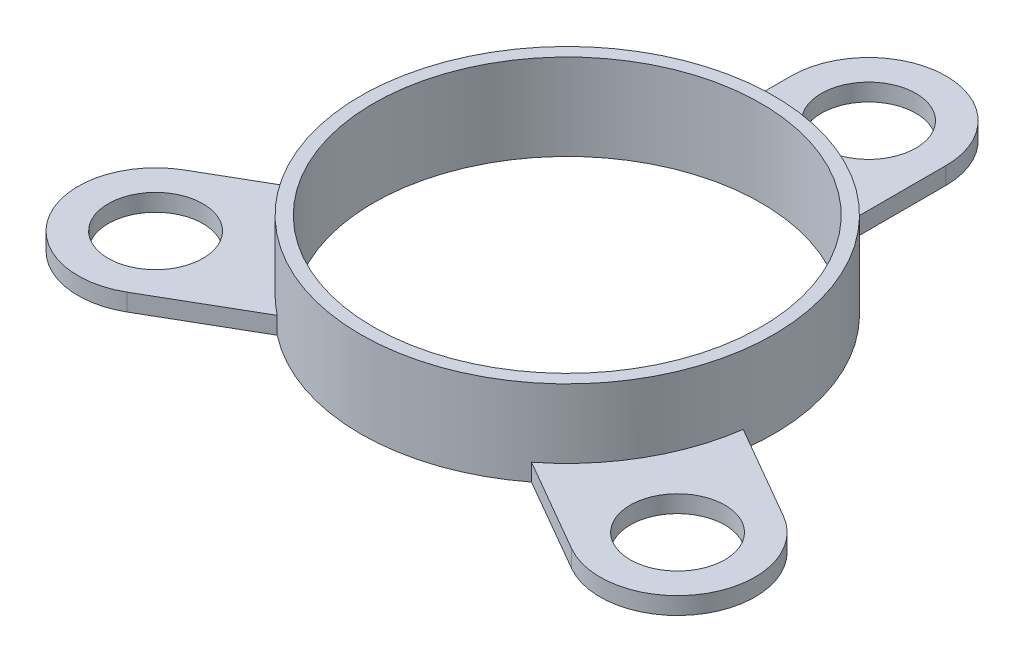
ISO-10303-21;
HEADER;
FILE_DESCRIPTION(('STEP AP214'),'2;1');
FILE_NAME('part.step','',(''),(''),'','','');
FILE_SCHEMA(('AUTOMOTIVE_DESIGN { 1 0 10303 214 1 1 1 1 }'));
ENDSEC;
DATA;
#1=APPLICATION_CONTEXT('core data for automotive mechanical design processes');
#2=APPLICATION_PROTOCOL_DEFINITION('international standard','automotive_design',2000,#1);
#3=PRODUCT_CONTEXT('',#1,'mechanical');
#4=PRODUCT('Part','Part','',(#3));
#5=PRODUCT_RELATED_PRODUCT_CATEGORY('part','',(#4));
#6=PRODUCT_DEFINITION_FORMATION('','',#4);
#7=PRODUCT_DEFINITION_CONTEXT('part definition',#1,'design');
#8=PRODUCT_DEFINITION('design','',#6,#7);
#9=PRODUCT_DEFINITION_SHAPE('','',#8);
#10=(LENGTH_UNIT() NAMED_UNIT(*) SI_UNIT(.MILLI.,.METRE.));
#11=(NAMED_UNIT(*) PLANE_ANGLE_UNIT() SI_UNIT($,.RADIAN.));
#12=(NAMED_UNIT(*) SI_UNIT($,.STERADIAN.) SOLID_ANGLE_UNIT());
#13=UNCERTAINTY_MEASURE_WITH_UNIT(LENGTH_MEASURE(1.E-05),#10,'distance_accuracy_value','');
#14=(GEOMETRIC_REPRESENTATION_CONTEXT(3) GLOBAL_UNCERTAINTY_ASSIGNED_CONTEXT((#13)) GLOBAL_UNIT_ASSIGNED_CONTEXT((#10,
#11,#12)) REPRESENTATION_CONTEXT('',''));
#15=CARTESIAN_POINT('',(0.,0.,0.));
#16=DIRECTION('',(0.,0.,1.));
#17=DIRECTION('',(1.,0.,0.));
#18=AXIS2_PLACEMENT_3D('',#15,#16,#17);
#19=CARTESIAN_POINT('',(-2.24999999999951,1.,-3.89711431702912));
#20=DIRECTION('',(-0.5,0.,-0.866025403784439));
#21=DIRECTION('',(-0.866025403784439,0.,0.5));
#22=AXIS2_PLACEMENT_3D('',#19,#20,#21);
#23=PLANE('',#22);
#24=DIRECTION('',(0.866025403784439,0.,-0.5));
#25=VECTOR('',#24,1.);
#26=CARTESIAN_POINT('',(-2.24999999999951,0.,-3.89711431702912));
#27=LINE('',#26,#25);
#28=CARTESIAN_POINT('',(-17.4054445662277,0.,4.8528856829712));
#29=VERTEX_POINT('',#28);
#30=CARTESIAN_POINT('',(-11.8839244339987,0.,1.66503454829297));
#31=VERTEX_POINT('',#30);
#32=EDGE_CURVE('E208',#29,#31,#27,.T.);
#33=ORIENTED_EDGE('',*,*,#32,.F.);
#34=DIRECTION('',(0.,-1.,0.));
#35=VECTOR('',#34,1.);
#36=CARTESIAN_POINT('',(-17.4054445662277,1.,4.8528856829712));
#37=LINE('',#36,#35);
#38=CARTESIAN_POINT('',(-17.4054445662277,1.,4.8528856829712));
#39=VERTEX_POINT('',#38);
#40=EDGE_CURVE('E42',#39,#29,#37,.T.);
#41=ORIENTED_EDGE('',*,*,#40,.F.);
#42=DIRECTION('',(0.866025403784439,0.,-0.5));
#43=VECTOR('',#42,1.);
#44=CARTESIAN_POINT('',(-2.24999999999951,1.,-3.89711431702912));
#45=LINE('',#44,#43);
#46=CARTESIAN_POINT('',(-11.8839244339987,1.,1.66503454829297));
#47=VERTEX_POINT('',#46);
#48=EDGE_CURVE('E216',#39,#47,#45,.T.);
#49=ORIENTED_EDGE('',*,*,#48,.T.);
#50=DIRECTION('',(0.,-1.,0.));
#51=VECTOR('',#50,1.);
#52=CARTESIAN_POINT('',(-11.883924433999,1.,1.66503454829302));
#53=LINE('',#52,#51);
#54=EDGE_CURVE('E11',#47,#31,#53,.T.);
#55=ORIENTED_EDGE('',*,*,#54,.T.);
#56=EDGE_LOOP('',(#33,#41,#49,#55));
#57=FACE_BOUND('',#56,.T.);
#58=ADVANCED_FACE('F35',(#57),#23,.T.);
#59=CARTESIAN_POINT('',(-15.1554445662279,1.,8.75000000000089));
#60=DIRECTION('',(0.,-1.,0.));
#61=DIRECTION('',(0.,0.,-1.));
#62=AXIS2_PLACEMENT_3D('',#59,#60,#61);
#63=CYLINDRICAL_SURFACE('',#62,4.49999999999999);
#64=CARTESIAN_POINT('',(-15.1554445662279,0.,8.75000000000089));
#65=DIRECTION('',(0.,1.,0.));
#66=DIRECTION('',(0.,0.,1.));
#67=AXIS2_PLACEMENT_3D('',#64,#65,#66);
#68=CIRCLE('',#67,4.49999999999999);
#69=CARTESIAN_POINT('',(-12.9054445662278,0.,12.6471143170311));
#70=VERTEX_POINT('',#69);
#71=EDGE_CURVE('E231',#29,#70,#68,.T.);
#72=ORIENTED_EDGE('',*,*,#71,.T.);
#73=DIRECTION('',(0.,-1.,0.));
#74=VECTOR('',#73,1.);
#75=CARTESIAN_POINT('',(-12.9054445662278,1.,12.6471143170311));
#76=LINE('',#75,#74);
#77=CARTESIAN_POINT('',(-12.9054445662278,1.,12.6471143170311));
#78=VERTEX_POINT('',#77);
#79=EDGE_CURVE('E240',#78,#70,#76,.T.);
#80=ORIENTED_EDGE('',*,*,#79,.F.);
#81=CARTESIAN_POINT('',(-15.1554445662279,1.,8.75000000000089));
#82=DIRECTION('',(0.,1.,0.));
#83=DIRECTION('',(0.,0.,1.));
#84=AXIS2_PLACEMENT_3D('',#81,#82,#83);
#85=CIRCLE('',#84,4.49999999999999);
#86=EDGE_CURVE('E220',#39,#78,#85,.T.);
#87=ORIENTED_EDGE('',*,*,#86,.F.);
#88=ORIENTED_EDGE('',*,*,#40,.T.);
#89=EDGE_LOOP('',(#72,#80,#87,#88));
#90=FACE_BOUND('',#89,.T.);
#91=ADVANCED_FACE('F245',(#90),#63,.T.);
#92=CARTESIAN_POINT('',(2.25000000000049,1.,3.89711431703083));
#93=DIRECTION('',(-0.499999999999999,0.,-0.866025403784439));
#94=DIRECTION('',(-0.866025403784439,0.,0.499999999999999));
#95=AXIS2_PLACEMENT_3D('',#92,#93,#94);
#96=PLANE('',#95);
#97=DIRECTION('',(0.866025403784439,0.,-0.499999999999999));
#98=VECTOR('',#97,1.);
#99=CARTESIAN_POINT('',(2.25000000000049,0.,3.89711431703083));
#100=LINE('',#99,#98);
#101=CARTESIAN_POINT('',(-7.3839244339988,0.,9.45926318235282));
#102=VERTEX_POINT('',#101);
#103=EDGE_CURVE('E233',#70,#102,#100,.T.);
#104=ORIENTED_EDGE('',*,*,#103,.T.);
#105=DIRECTION('',(0.,-1.,0.));
#106=VECTOR('',#105,1.);
#107=CARTESIAN_POINT('',(-7.3839244339988,1.,9.45926318235282));
#108=LINE('',#107,#106);
#109=CARTESIAN_POINT('',(-7.38392443399828,1.,9.45926318235216));
#110=VERTEX_POINT('',#109);
#111=EDGE_CURVE('E228',#110,#102,#108,.T.);
#112=ORIENTED_EDGE('',*,*,#111,.F.);
#113=DIRECTION('',(0.866025403784439,0.,-0.499999999999999));
#114=VECTOR('',#113,1.);
#115=CARTESIAN_POINT('',(2.25000000000049,1.,3.89711431703083));
#116=LINE('',#115,#114);
#117=EDGE_CURVE('E222',#78,#110,#116,.T.);
#118=ORIENTED_EDGE('',*,*,#117,.F.);
#119=ORIENTED_EDGE('',*,*,#79,.T.);
#120=EDGE_LOOP('',(#104,#112,#118,#119));
#121=FACE_BOUND('',#120,.T.);
#122=ADVANCED_FACE('F263',(#121),#96,.F.);
#123=CARTESIAN_POINT('',(-15.1554445662279,1.,8.75000000000089));
#124=DIRECTION('',(0.,-1.,0.));
#125=DIRECTION('',(0.,0.,-1.));
#126=AXIS2_PLACEMENT_3D('',#123,#124,#125);
#127=CYLINDRICAL_SURFACE('',#126,2.7500000000006);
#128=CARTESIAN_POINT('',(-15.1554445662279,1.,8.75000000000089));
#129=DIRECTION('',(0.,1.,0.));
#130=DIRECTION('',(0.,0.,1.));
#131=AXIS2_PLACEMENT_3D('',#128,#129,#130);
#132=CIRCLE('',#131,2.7500000000006);
#133=CARTESIAN_POINT('',(-15.1554445662279,1.,11.5000000000015));
#134=VERTEX_POINT('',#133);
#135=EDGE_CURVE('E225',#134,#134,#132,.T.);
#136=ORIENTED_EDGE('',*,*,#135,.T.);
#137=EDGE_LOOP('',(#136));
#138=FACE_BOUND('',#137,.T.);
#139=CARTESIAN_POINT('',(-15.1554445662279,0.,8.75000000000089));
#140=DIRECTION('',(0.,1.,0.));
#141=DIRECTION('',(0.,0.,1.));
#142=AXIS2_PLACEMENT_3D('',#139,#140,#141);
#143=CIRCLE('',#142,2.7500000000006);
#144=CARTESIAN_POINT('',(-15.1554445662279,0.,11.5000000000015));
#145=VERTEX_POINT('',#144);
#146=EDGE_CURVE('E217',#145,#145,#143,.T.);
#147=ORIENTED_EDGE('',*,*,#146,.F.);
#148=EDGE_LOOP('',(#147));
#149=FACE_BOUND('',#148,.T.);
#150=ADVANCED_FACE('F302',(#138,#149),#127,.F.);
#151=CARTESIAN_POINT('',(0.,1.,0.));
#152=DIRECTION('',(0.,1.,0.));
#153=DIRECTION('',(0.,0.,1.));
#154=AXIS2_PLACEMENT_3D('',#151,#152,#153);
#155=PLANE('',#154);
#156=CARTESIAN_POINT('',(0.,1.,0.));
#157=DIRECTION('',(0.,1.,0.));
#158=DIRECTION('',(0.,0.,1.));
#159=AXIS2_PLACEMENT_3D('',#156,#157,#158);
#160=CIRCLE('',#159,12.);
#161=EDGE_CURVE('E214',#47,#110,#160,.T.);
#162=ORIENTED_EDGE('',*,*,#161,.F.);
#163=ORIENTED_EDGE('',*,*,#48,.F.);
#164=ORIENTED_EDGE('',*,*,#86,.T.);
#165=ORIENTED_EDGE('',*,*,#117,.T.);
#166=EDGE_LOOP('',(#162,#163,#164,#165));
#167=FACE_BOUND('',#166,.T.);
#168=ORIENTED_EDGE('',*,*,#135,.F.);
#169=EDGE_LOOP('',(#168));
#170=FACE_BOUND('',#169,.T.);
#171=ADVANCED_FACE('F258',(#167,#170),#155,.T.);
#172=CARTESIAN_POINT('',(0.,0.,0.));
#173=DIRECTION('',(0.,1.,0.));
#174=DIRECTION('',(0.,0.,1.));
#175=AXIS2_PLACEMENT_3D('',#172,#173,#174);
#176=PLANE('',#175);
#177=ORIENTED_EDGE('',*,*,#32,.T.);
#178=CARTESIAN_POINT('',(0.,0.,0.));
#179=DIRECTION('',(0.,1.,0.));
#180=DIRECTION('',(0.,0.,1.));
#181=AXIS2_PLACEMENT_3D('',#178,#179,#180);
#182=CIRCLE('',#181,12.);
#183=CARTESIAN_POINT('',(-4.5,0.,-11.1242977306435));
#184=VERTEX_POINT('',#183);
#185=EDGE_CURVE('E211',#184,#31,#182,.T.);
#186=ORIENTED_EDGE('',*,*,#185,.F.);
#187=DIRECTION('',(0.,0.,1.));
#188=VECTOR('',#187,1.);
#189=CARTESIAN_POINT('',(-4.5,0.,0.));
#190=LINE('',#189,#188);
#191=CARTESIAN_POINT('',(-4.5,0.,-17.5));
#192=VERTEX_POINT('',#191);
#193=EDGE_CURVE('E168',#192,#184,#190,.T.);
#194=ORIENTED_EDGE('',*,*,#193,.F.);
#195=CARTESIAN_POINT('',(0.,0.,-17.5));
#196=DIRECTION('',(0.,1.,0.));
#197=DIRECTION('',(0.,0.,1.));
#198=AXIS2_PLACEMENT_3D('',#195,#196,#197);
#199=CIRCLE('',#198,4.5);
#200=CARTESIAN_POINT('',(4.5,0.,-17.5));
#201=VERTEX_POINT('',#200);
#202=EDGE_CURVE('E185',#201,#192,#199,.T.);
#203=ORIENTED_EDGE('',*,*,#202,.F.);
#204=DIRECTION('',(0.,0.,1.));
#205=VECTOR('',#204,1.);
#206=CARTESIAN_POINT('',(4.49999999999999,0.,0.));
#207=LINE('',#206,#205);
#208=CARTESIAN_POINT('',(4.5,0.,-11.1242977306435));
#209=VERTEX_POINT('',#208);
#210=EDGE_CURVE('E182',#201,#209,#207,.T.);
#211=ORIENTED_EDGE('',*,*,#210,.T.);
#212=CARTESIAN_POINT('',(11.8839244339995,0.,1.66503454829207));
#213=VERTEX_POINT('',#212);
#214=EDGE_CURVE('E213',#213,#209,#182,.T.);
#215=ORIENTED_EDGE('',*,*,#214,.F.);
#216=DIRECTION('',(-0.866025403784438,0.,-0.500000000000001));
#217=VECTOR('',#216,1.);
#218=CARTESIAN_POINT('',(2.25000000000006,0.,-3.89711431703006));
#219=LINE('',#218,#217);
#220=CARTESIAN_POINT('',(17.4054445662285,0.,4.8528856829704));
#221=VERTEX_POINT('',#220);
#222=EDGE_CURVE('E155',#221,#213,#219,.T.);
#223=ORIENTED_EDGE('',*,*,#222,.F.);
#224=CARTESIAN_POINT('',(15.1554445662283,0.,8.75000000000064));
#225=DIRECTION('',(0.,1.,0.));
#226=DIRECTION('',(0.,0.,1.));
#227=AXIS2_PLACEMENT_3D('',#224,#225,#226);
#228=CIRCLE('',#227,4.49999999999999);
#229=CARTESIAN_POINT('',(12.9054445662285,0.,12.6471143170303));
#230=VERTEX_POINT('',#229);
#231=EDGE_CURVE('E153',#230,#221,#228,.T.);
#232=ORIENTED_EDGE('',*,*,#231,.F.);
#233=DIRECTION('',(-0.866025403784439,0.,-0.5));
#234=VECTOR('',#233,1.);
#235=CARTESIAN_POINT('',(-2.24999999999995,0.,3.89711431702988));
#236=LINE('',#235,#234);
#237=CARTESIAN_POINT('',(7.38392443399922,0.,9.45926318235143));
#238=VERTEX_POINT('',#237);
#239=EDGE_CURVE('E128',#230,#238,#236,.T.);
#240=ORIENTED_EDGE('',*,*,#239,.T.);
#241=EDGE_CURVE('E205',#102,#238,#182,.T.);
#242=ORIENTED_EDGE('',*,*,#241,.F.);
#243=ORIENTED_EDGE('',*,*,#103,.F.);
#244=ORIENTED_EDGE('',*,*,#71,.F.);
#245=EDGE_LOOP('',(#177,#186,#194,#203,#211,#215,#223,#232,#240,#242,#243,#244));
#246=FACE_BOUND('',#245,.T.);
#247=ORIENTED_EDGE('',*,*,#146,.T.);
#248=EDGE_LOOP('',(#247));
#249=FACE_BOUND('',#248,.T.);
#250=CARTESIAN_POINT('',(0.,0.,0.));
#251=DIRECTION('',(0.,1.,0.));
#252=DIRECTION('',(0.,0.,1.));
#253=AXIS2_PLACEMENT_3D('',#250,#251,#252);
#254=CIRCLE('',#253,11.25);
#255=CARTESIAN_POINT('',(0.,0.,11.25));
#256=VERTEX_POINT('',#255);
#257=EDGE_CURVE('E200',#256,#256,#254,.T.);
#258=ORIENTED_EDGE('',*,*,#257,.T.);
#259=EDGE_LOOP('',(#258));
#260=FACE_BOUND('',#259,.T.);
#261=CARTESIAN_POINT('',(0.,0.,-17.5));
#262=DIRECTION('',(0.,1.,0.));
#263=DIRECTION('',(0.,0.,1.));
#264=AXIS2_PLACEMENT_3D('',#261,#262,#263);
#265=CIRCLE('',#264,2.75);
#266=CARTESIAN_POINT('',(0.,0.,-14.75));
#267=VERTEX_POINT('',#266);
#268=EDGE_CURVE('E163',#267,#267,#265,.T.);
#269=ORIENTED_EDGE('',*,*,#268,.T.);
#270=EDGE_LOOP('',(#269));
#271=FACE_BOUND('',#270,.T.);
#272=CARTESIAN_POINT('',(15.1554445662283,0.,8.75000000000064));
#273=DIRECTION('',(0.,1.,0.));
#274=DIRECTION('',(0.,0.,1.));
#275=AXIS2_PLACEMENT_3D('',#272,#273,#274);
#276=CIRCLE('',#275,2.7499999999996);
#277=CARTESIAN_POINT('',(15.1554445662283,0.,11.5000000000002));
#278=VERTEX_POINT('',#277);
#279=EDGE_CURVE('E144',#278,#278,#276,.T.);
#280=ORIENTED_EDGE('',*,*,#279,.T.);
#281=EDGE_LOOP('',(#280));
#282=FACE_BOUND('',#281,.T.);
#283=ADVANCED_FACE('F252',(#246,#249,#260,#271,#282),#176,.F.);
#284=CARTESIAN_POINT('',(0.,5.,0.));
#285=DIRECTION('',(0.,-1.,0.));
#286=DIRECTION('',(0.,0.,-1.));
#287=AXIS2_PLACEMENT_3D('',#284,#285,#286);
#288=CYLINDRICAL_SURFACE('',#287,11.25);
#289=CARTESIAN_POINT('',(0.,5.,0.));
#290=DIRECTION('',(0.,1.,0.));
#291=DIRECTION('',(0.,0.,1.));
#292=AXIS2_PLACEMENT_3D('',#289,#290,#291);
#293=CIRCLE('',#292,11.25);
#294=CARTESIAN_POINT('',(0.,5.,11.25));
#295=VERTEX_POINT('',#294);
#296=EDGE_CURVE('E201',#295,#295,#293,.T.);
#297=ORIENTED_EDGE('',*,*,#296,.T.);
#298=EDGE_LOOP('',(#297));
#299=FACE_BOUND('',#298,.T.);
#300=ORIENTED_EDGE('',*,*,#257,.F.);
#301=EDGE_LOOP('',(#300));
#302=FACE_BOUND('',#301,.T.);
#303=ADVANCED_FACE('F310',(#299,#302),#288,.F.);
#304=CARTESIAN_POINT('',(0.,5.,0.));
#305=DIRECTION('',(0.,-1.,0.));
#306=DIRECTION('',(0.,0.,-1.));
#307=AXIS2_PLACEMENT_3D('',#304,#305,#306);
#308=CYLINDRICAL_SURFACE('',#307,12.);
#309=ORIENTED_EDGE('',*,*,#241,.T.);
#310=DIRECTION('',(0.,-1.,0.));
#311=VECTOR('',#310,1.);
#312=CARTESIAN_POINT('',(7.38392443399978,1.,9.45926318235215));
#313=LINE('',#312,#311);
#314=CARTESIAN_POINT('',(7.38392443399922,1.,9.45926318235143));
#315=VERTEX_POINT('',#314);
#316=EDGE_CURVE('E54',#315,#238,#313,.T.);
#317=ORIENTED_EDGE('',*,*,#316,.F.);
#318=CARTESIAN_POINT('',(0.,1.,0.));
#319=DIRECTION('',(0.,1.,0.));
#320=DIRECTION('',(0.,0.,1.));
#321=AXIS2_PLACEMENT_3D('',#318,#319,#320);
#322=CIRCLE('',#321,12.);
#323=CARTESIAN_POINT('',(11.8839244339988,1.,1.66503454829197));
#324=VERTEX_POINT('',#323);
#325=EDGE_CURVE('E49',#315,#324,#322,.T.);
#326=ORIENTED_EDGE('',*,*,#325,.T.);
#327=DIRECTION('',(0.,-1.,0.));
#328=VECTOR('',#327,1.);
#329=CARTESIAN_POINT('',(11.8839244339995,1.,1.66503454829207));
#330=LINE('',#329,#328);
#331=EDGE_CURVE('E151',#324,#213,#330,.T.);
#332=ORIENTED_EDGE('',*,*,#331,.T.);
#333=ORIENTED_EDGE('',*,*,#214,.T.);
#334=DIRECTION('',(0.,-1.,0.));
#335=VECTOR('',#334,1.);
#336=CARTESIAN_POINT('',(4.5,1.,-11.1242977306435));
#337=LINE('',#336,#335);
#338=CARTESIAN_POINT('',(4.5,1.,-11.1242977306435));
#339=VERTEX_POINT('',#338);
#340=EDGE_CURVE('E197',#339,#209,#337,.T.);
#341=ORIENTED_EDGE('',*,*,#340,.F.);
#342=CARTESIAN_POINT('',(0.,1.,0.));
#343=DIRECTION('',(0.,1.,0.));
#344=DIRECTION('',(0.,0.,1.));
#345=AXIS2_PLACEMENT_3D('',#342,#343,#344);
#346=CIRCLE('',#345,12.);
#347=CARTESIAN_POINT('',(-4.5,1.,-11.1242977306435));
#348=VERTEX_POINT('',#347);
#349=EDGE_CURVE('E167',#339,#348,#346,.T.);
#350=ORIENTED_EDGE('',*,*,#349,.T.);
#351=DIRECTION('',(0.,-1.,0.));
#352=VECTOR('',#351,1.);
#353=CARTESIAN_POINT('',(-4.5,1.,-11.1242977306435));
#354=LINE('',#353,#352);
#355=EDGE_CURVE('E179',#348,#184,#354,.T.);
#356=ORIENTED_EDGE('',*,*,#355,.T.);
#357=ORIENTED_EDGE('',*,*,#185,.T.);
#358=ORIENTED_EDGE('',*,*,#54,.F.);
#359=ORIENTED_EDGE('',*,*,#161,.T.);
#360=ORIENTED_EDGE('',*,*,#111,.T.);
#361=EDGE_LOOP('',(#309,#317,#326,#332,#333,#341,#350,#356,#357,#358,#359,#360));
#362=FACE_BOUND('',#361,.T.);
#363=CARTESIAN_POINT('',(0.,5.,0.));
#364=DIRECTION('',(0.,1.,0.));
#365=DIRECTION('',(0.,0.,1.));
#366=AXIS2_PLACEMENT_3D('',#363,#364,#365);
#367=CIRCLE('',#366,12.);
#368=CARTESIAN_POINT('',(0.,5.,12.));
#369=VERTEX_POINT('',#368);
#370=EDGE_CURVE('E204',#369,#369,#367,.T.);
#371=ORIENTED_EDGE('',*,*,#370,.F.);
#372=EDGE_LOOP('',(#371));
#373=FACE_BOUND('',#372,.T.);
#374=ADVANCED_FACE('F255',(#362,#373),#308,.T.);
#375=CARTESIAN_POINT('',(0.,5.,0.));
#376=DIRECTION('',(0.,1.,0.));
#377=DIRECTION('',(0.,0.,1.));
#378=AXIS2_PLACEMENT_3D('',#375,#376,#377);
#379=PLANE('',#378);
#380=ORIENTED_EDGE('',*,*,#296,.F.);
#381=EDGE_LOOP('',(#380));
#382=FACE_BOUND('',#381,.T.);
#383=ORIENTED_EDGE('',*,*,#370,.T.);
#384=EDGE_LOOP('',(#383));
#385=FACE_BOUND('',#384,.T.);
#386=ADVANCED_FACE('F318',(#382,#385),#379,.T.);
#387=CARTESIAN_POINT('',(4.49999999999999,1.,0.));
#388=DIRECTION('',(1.,0.,0.));
#389=DIRECTION('',(0.,0.,-1.));
#390=AXIS2_PLACEMENT_3D('',#387,#388,#389);
#391=PLANE('',#390);
#392=ORIENTED_EDGE('',*,*,#210,.F.);
#393=DIRECTION('',(0.,-1.,0.));
#394=VECTOR('',#393,1.);
#395=CARTESIAN_POINT('',(4.5,1.,-17.5));
#396=LINE('',#395,#394);
#397=CARTESIAN_POINT('',(4.5,1.,-17.5));
#398=VERTEX_POINT('',#397);
#399=EDGE_CURVE('E195',#398,#201,#396,.T.);
#400=ORIENTED_EDGE('',*,*,#399,.F.);
#401=DIRECTION('',(0.,0.,1.));
#402=VECTOR('',#401,1.);
#403=CARTESIAN_POINT('',(4.49999999999999,1.,0.));
#404=LINE('',#403,#402);
#405=EDGE_CURVE('E170',#398,#339,#404,.T.);
#406=ORIENTED_EDGE('',*,*,#405,.T.);
#407=ORIENTED_EDGE('',*,*,#340,.T.);
#408=EDGE_LOOP('',(#392,#400,#406,#407));
#409=FACE_BOUND('',#408,.T.);
#410=ADVANCED_FACE('F271',(#409),#391,.T.);
#411=CARTESIAN_POINT('',(0.,1.,-17.5));
#412=DIRECTION('',(0.,-1.,0.));
#413=DIRECTION('',(0.,0.,-1.));
#414=AXIS2_PLACEMENT_3D('',#411,#412,#413);
#415=CYLINDRICAL_SURFACE('',#414,4.5);
#416=ORIENTED_EDGE('',*,*,#202,.T.);
#417=DIRECTION('',(0.,-1.,0.));
#418=VECTOR('',#417,1.);
#419=CARTESIAN_POINT('',(-4.5,1.,-17.5));
#420=LINE('',#419,#418);
#421=CARTESIAN_POINT('',(-4.5,1.,-17.5));
#422=VERTEX_POINT('',#421);
#423=EDGE_CURVE('E192',#422,#192,#420,.T.);
#424=ORIENTED_EDGE('',*,*,#423,.F.);
#425=CARTESIAN_POINT('',(0.,1.,-17.5));
#426=DIRECTION('',(0.,1.,0.));
#427=DIRECTION('',(0.,0.,1.));
#428=AXIS2_PLACEMENT_3D('',#425,#426,#427);
#429=CIRCLE('',#428,4.5);
#430=EDGE_CURVE('E173',#398,#422,#429,.T.);
#431=ORIENTED_EDGE('',*,*,#430,.F.);
#432=ORIENTED_EDGE('',*,*,#399,.T.);
#433=EDGE_LOOP('',(#416,#424,#431,#432));
#434=FACE_BOUND('',#433,.T.);
#435=ADVANCED_FACE('F276',(#434),#415,.T.);
#436=CARTESIAN_POINT('',(0.,1.,-17.5));
#437=DIRECTION('',(0.,-1.,0.));
#438=DIRECTION('',(0.,0.,-1.));
#439=AXIS2_PLACEMENT_3D('',#436,#437,#438);
#440=CYLINDRICAL_SURFACE('',#439,2.75);
#441=CARTESIAN_POINT('',(0.,1.,-17.5));
#442=DIRECTION('',(0.,1.,0.));
#443=DIRECTION('',(0.,0.,1.));
#444=AXIS2_PLACEMENT_3D('',#441,#442,#443);
#445=CIRCLE('',#444,2.75);
#446=CARTESIAN_POINT('',(0.,1.,-14.75));
#447=VERTEX_POINT('',#446);
#448=EDGE_CURVE('E164',#447,#447,#445,.T.);
#449=ORIENTED_EDGE('',*,*,#448,.T.);
#450=EDGE_LOOP('',(#449));
#451=FACE_BOUND('',#450,.T.);
#452=ORIENTED_EDGE('',*,*,#268,.F.);
#453=EDGE_LOOP('',(#452));
#454=FACE_BOUND('',#453,.T.);
#455=ADVANCED_FACE('F284',(#451,#454),#440,.F.);
#456=CARTESIAN_POINT('',(-4.5,1.,0.));
#457=DIRECTION('',(1.,0.,0.));
#458=DIRECTION('',(0.,0.,-1.));
#459=AXIS2_PLACEMENT_3D('',#456,#457,#458);
#460=PLANE('',#459);
#461=ORIENTED_EDGE('',*,*,#193,.T.);
#462=ORIENTED_EDGE('',*,*,#355,.F.);
#463=DIRECTION('',(0.,0.,1.));
#464=VECTOR('',#463,1.);
#465=CARTESIAN_POINT('',(-4.5,1.,0.));
#466=LINE('',#465,#464);
#467=EDGE_CURVE('E176',#422,#348,#466,.T.);
#468=ORIENTED_EDGE('',*,*,#467,.F.);
#469=ORIENTED_EDGE('',*,*,#423,.T.);
#470=EDGE_LOOP('',(#461,#462,#468,#469));
#471=FACE_BOUND('',#470,.T.);
#472=ADVANCED_FACE('F282',(#471),#460,.F.);
#473=CARTESIAN_POINT('',(0.,1.,0.));
#474=DIRECTION('',(0.,1.,0.));
#475=DIRECTION('',(0.,0.,1.));
#476=AXIS2_PLACEMENT_3D('',#473,#474,#475);
#477=PLANE('',#476);
#478=ORIENTED_EDGE('',*,*,#448,.F.);
#479=EDGE_LOOP('',(#478));
#480=FACE_BOUND('',#479,.T.);
#481=ORIENTED_EDGE('',*,*,#349,.F.);
#482=ORIENTED_EDGE('',*,*,#405,.F.);
#483=ORIENTED_EDGE('',*,*,#430,.T.);
#484=ORIENTED_EDGE('',*,*,#467,.T.);
#485=EDGE_LOOP('',(#481,#482,#483,#484));
#486=FACE_BOUND('',#485,.T.);
#487=ADVANCED_FACE('F279',(#480,#486),#477,.T.);
#488=CARTESIAN_POINT('',(-2.24999999999995,1.,3.89711431702988));
#489=DIRECTION('',(-0.5,0.,0.866025403784439));
#490=DIRECTION('',(0.866025403784439,0.,0.5));
#491=AXIS2_PLACEMENT_3D('',#488,#489,#490);
#492=PLANE('',#491);
#493=ORIENTED_EDGE('',*,*,#239,.F.);
#494=DIRECTION('',(0.,-1.,0.));
#495=VECTOR('',#494,1.);
#496=CARTESIAN_POINT('',(12.9054445662285,1.,12.6471143170303));
#497=LINE('',#496,#495);
#498=CARTESIAN_POINT('',(12.9054445662285,1.,12.6471143170303));
#499=VERTEX_POINT('',#498);
#500=EDGE_CURVE('E122',#499,#230,#497,.T.);
#501=ORIENTED_EDGE('',*,*,#500,.F.);
#502=DIRECTION('',(-0.866025403784439,0.,-0.5));
#503=VECTOR('',#502,1.);
#504=CARTESIAN_POINT('',(-2.24999999999995,1.,3.89711431702988));
#505=LINE('',#504,#503);
#506=EDGE_CURVE('E126',#499,#315,#505,.T.);
#507=ORIENTED_EDGE('',*,*,#506,.T.);
#508=ORIENTED_EDGE('',*,*,#316,.T.);
#509=EDGE_LOOP('',(#493,#501,#507,#508));
#510=FACE_BOUND('',#509,.T.);
#511=ADVANCED_FACE('F124',(#510),#492,.T.);
#512=CARTESIAN_POINT('',(15.1554445662283,1.,8.75000000000064));
#513=DIRECTION('',(0.,-1.,0.));
#514=DIRECTION('',(0.,0.,-1.));
#515=AXIS2_PLACEMENT_3D('',#512,#513,#514);
#516=CYLINDRICAL_SURFACE('',#515,4.49999999999999);
#517=ORIENTED_EDGE('',*,*,#231,.T.);
#518=DIRECTION('',(0.,-1.,0.));
#519=VECTOR('',#518,1.);
#520=CARTESIAN_POINT('',(17.4054445662285,1.,4.8528856829704));
#521=LINE('',#520,#519);
#522=CARTESIAN_POINT('',(17.4054445662285,1.,4.8528856829704));
#523=VERTEX_POINT('',#522);
#524=EDGE_CURVE('E131',#523,#221,#521,.T.);
#525=ORIENTED_EDGE('',*,*,#524,.F.);
#526=CARTESIAN_POINT('',(15.1554445662283,1.,8.75000000000064));
#527=DIRECTION('',(0.,1.,0.));
#528=DIRECTION('',(0.,0.,1.));
#529=AXIS2_PLACEMENT_3D('',#526,#527,#528);
#530=CIRCLE('',#529,4.49999999999999);
#531=EDGE_CURVE('E134',#499,#523,#530,.T.);
#532=ORIENTED_EDGE('',*,*,#531,.F.);
#533=ORIENTED_EDGE('',*,*,#500,.T.);
#534=EDGE_LOOP('',(#517,#525,#532,#533));
#535=FACE_BOUND('',#534,.T.);
#536=ADVANCED_FACE('F135',(#535),#516,.T.);
#537=CARTESIAN_POINT('',(2.25000000000006,1.,-3.89711431703006));
#538=DIRECTION('',(-0.500000000000001,0.,0.866025403784438));
#539=DIRECTION('',(0.866025403784438,0.,0.500000000000001));
#540=AXIS2_PLACEMENT_3D('',#537,#538,#539);
#541=PLANE('',#540);
#542=ORIENTED_EDGE('',*,*,#222,.T.);
#543=ORIENTED_EDGE('',*,*,#331,.F.);
#544=DIRECTION('',(-0.866025403784438,0.,-0.500000000000001));
#545=VECTOR('',#544,1.);
#546=CARTESIAN_POINT('',(2.25000000000006,1.,-3.89711431703006));
#547=LINE('',#546,#545);
#548=EDGE_CURVE('E139',#523,#324,#547,.T.);
#549=ORIENTED_EDGE('',*,*,#548,.F.);
#550=ORIENTED_EDGE('',*,*,#524,.T.);
#551=EDGE_LOOP('',(#542,#543,#549,#550));
#552=FACE_BOUND('',#551,.T.);
#553=ADVANCED_FACE('F266',(#552),#541,.F.);
#554=CARTESIAN_POINT('',(15.1554445662283,1.,8.75000000000064));
#555=DIRECTION('',(0.,-1.,0.));
#556=DIRECTION('',(0.,0.,-1.));
#557=AXIS2_PLACEMENT_3D('',#554,#555,#556);
#558=CYLINDRICAL_SURFACE('',#557,2.7499999999996);
#559=CARTESIAN_POINT('',(15.1554445662283,1.,8.75000000000064));
#560=DIRECTION('',(0.,1.,0.));
#561=DIRECTION('',(0.,0.,1.));
#562=AXIS2_PLACEMENT_3D('',#559,#560,#561);
#563=CIRCLE('',#562,2.7499999999996);
#564=CARTESIAN_POINT('',(15.1554445662283,1.,11.5000000000002));
#565=VERTEX_POINT('',#564);
#566=EDGE_CURVE('E148',#565,#565,#563,.T.);
#567=ORIENTED_EDGE('',*,*,#566,.T.);
#568=EDGE_LOOP('',(#567));
#569=FACE_BOUND('',#568,.T.);
#570=ORIENTED_EDGE('',*,*,#279,.F.);
#571=EDGE_LOOP('',(#570));
#572=FACE_BOUND('',#571,.T.);
#573=ADVANCED_FACE('F368',(#569,#572),#558,.F.);
#574=CARTESIAN_POINT('',(0.,1.,0.));
#575=DIRECTION('',(0.,1.,0.));
#576=DIRECTION('',(0.,0.,1.));
#577=AXIS2_PLACEMENT_3D('',#574,#575,#576);
#578=PLANE('',#577);
#579=ORIENTED_EDGE('',*,*,#325,.F.);
#580=ORIENTED_EDGE('',*,*,#506,.F.);
#581=ORIENTED_EDGE('',*,*,#531,.T.);
#582=ORIENTED_EDGE('',*,*,#548,.T.);
#583=EDGE_LOOP('',(#579,#580,#581,#582));
#584=FACE_BOUND('',#583,.T.);
#585=ORIENTED_EDGE('',*,*,#566,.F.);
#586=EDGE_LOOP('',(#585));
#587=FACE_BOUND('',#586,.T.);
#588=ADVANCED_FACE('F141',(#584,#587),#578,.T.);
#589=CLOSED_SHELL('',(#58,#91,#122,#150,#171,#283,#303,#374,#386,#410,#435,#455,#472,#487,#511,
#536,#553,#573,#588));
#590=MANIFOLD_SOLID_BREP('B2',#589);
#591=ADVANCED_BREP_SHAPE_REPRESENTATION('',(#18,#590),#14);
#592=SHAPE_DEFINITION_REPRESENTATION(#9,#591);
ENDSEC;
END-ISO-10303-21;
